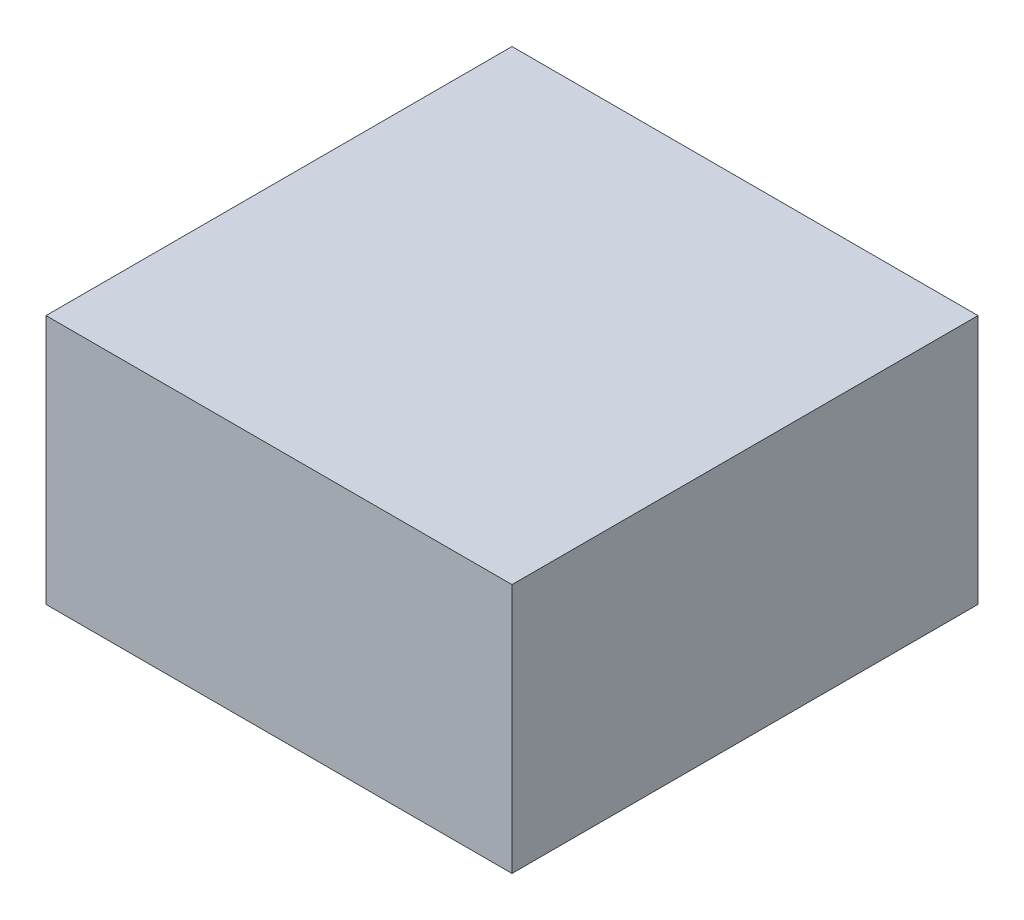
ISO-10303-21;
HEADER;
FILE_DESCRIPTION(('STEP AP214'),'2;1');
FILE_NAME('part.step','',(''),(''),'','','');
FILE_SCHEMA(('AUTOMOTIVE_DESIGN { 1 0 10303 214 1 1 1 1 }'));
ENDSEC;
DATA;
#1=APPLICATION_CONTEXT('core data for automotive mechanical design processes');
#2=APPLICATION_PROTOCOL_DEFINITION('international standard','automotive_design',2000,#1);
#3=PRODUCT_CONTEXT('',#1,'mechanical');
#4=PRODUCT('Part','Part','',(#3));
#5=PRODUCT_RELATED_PRODUCT_CATEGORY('part','',(#4));
#6=PRODUCT_DEFINITION_FORMATION('','',#4);
#7=PRODUCT_DEFINITION_CONTEXT('part definition',#1,'design');
#8=PRODUCT_DEFINITION('design','',#6,#7);
#9=PRODUCT_DEFINITION_SHAPE('','',#8);
#10=(LENGTH_UNIT() NAMED_UNIT(*) SI_UNIT(.MILLI.,.METRE.));
#11=(NAMED_UNIT(*) PLANE_ANGLE_UNIT() SI_UNIT($,.RADIAN.));
#12=(NAMED_UNIT(*) SI_UNIT($,.STERADIAN.) SOLID_ANGLE_UNIT());
#13=UNCERTAINTY_MEASURE_WITH_UNIT(LENGTH_MEASURE(1.E-05),#10,'distance_accuracy_value','');
#14=(GEOMETRIC_REPRESENTATION_CONTEXT(3) GLOBAL_UNCERTAINTY_ASSIGNED_CONTEXT((#13)) GLOBAL_UNIT_ASSIGNED_CONTEXT((#10,
#11,#12)) REPRESENTATION_CONTEXT('',''));
#15=CARTESIAN_POINT('',(0.,0.,0.));
#16=DIRECTION('',(0.,0.,1.));
#17=DIRECTION('',(1.,0.,0.));
#18=AXIS2_PLACEMENT_3D('',#15,#16,#17);
#19=CARTESIAN_POINT('',(6.3738019169329,36.1182108626198,95.));
#20=DIRECTION('',(1.,0.,0.));
#21=DIRECTION('',(0.,1.,0.));
#22=AXIS2_PLACEMENT_3D('',#19,#20,#21);
#23=PLANE('',#22);
#24=DIRECTION('',(0.,-1.,0.));
#25=VECTOR('',#24,1.);
#26=CARTESIAN_POINT('',(6.3738019169329,36.1182108626198,0.));
#27=LINE('',#26,#25);
#28=CARTESIAN_POINT('',(6.3738019169329,36.1182108626198,0.));
#29=VERTEX_POINT('',#28);
#30=CARTESIAN_POINT('',(6.37380191693291,-14.8817891373802,0.));
#31=VERTEX_POINT('',#30);
#32=EDGE_CURVE('E107',#29,#31,#27,.T.);
#33=ORIENTED_EDGE('',*,*,#32,.T.);
#34=DIRECTION('',(0.,0.,-1.));
#35=VECTOR('',#34,1.);
#36=CARTESIAN_POINT('',(6.37380191693291,-14.8817891373802,95.));
#37=LINE('',#36,#35);
#38=CARTESIAN_POINT('',(6.37380191693291,-14.8817891373802,95.));
#39=VERTEX_POINT('',#38);
#40=EDGE_CURVE('E11',#39,#31,#37,.T.);
#41=ORIENTED_EDGE('',*,*,#40,.F.);
#42=DIRECTION('',(0.,-1.,0.));
#43=VECTOR('',#42,1.);
#44=CARTESIAN_POINT('',(6.3738019169329,36.1182108626198,95.));
#45=LINE('',#44,#43);
#46=CARTESIAN_POINT('',(6.3738019169329,36.1182108626198,95.));
#47=VERTEX_POINT('',#46);
#48=EDGE_CURVE('E91',#47,#39,#45,.T.);
#49=ORIENTED_EDGE('',*,*,#48,.F.);
#50=DIRECTION('',(0.,0.,-1.));
#51=VECTOR('',#50,1.);
#52=CARTESIAN_POINT('',(6.3738019169329,36.1182108626198,95.));
#53=LINE('',#52,#51);
#54=EDGE_CURVE('E103',#47,#29,#53,.T.);
#55=ORIENTED_EDGE('',*,*,#54,.T.);
#56=EDGE_LOOP('',(#33,#41,#49,#55));
#57=FACE_BOUND('',#56,.T.);
#58=ADVANCED_FACE('F39',(#57),#23,.F.);
#59=CARTESIAN_POINT('',(6.37380191693291,-14.8817891373802,95.));
#60=DIRECTION('',(0.,1.,0.));
#61=DIRECTION('',(0.,0.,1.));
#62=AXIS2_PLACEMENT_3D('',#59,#60,#61);
#63=PLANE('',#62);
#64=DIRECTION('',(1.,0.,0.));
#65=VECTOR('',#64,1.);
#66=CARTESIAN_POINT('',(6.37380191693291,-14.8817891373802,0.));
#67=LINE('',#66,#65);
#68=CARTESIAN_POINT('',(101.373801916933,-14.8817891373802,0.));
#69=VERTEX_POINT('',#68);
#70=EDGE_CURVE('E96',#31,#69,#67,.T.);
#71=ORIENTED_EDGE('',*,*,#70,.T.);
#72=DIRECTION('',(0.,0.,-1.));
#73=VECTOR('',#72,1.);
#74=CARTESIAN_POINT('',(101.373801916933,-14.8817891373802,95.));
#75=LINE('',#74,#73);
#76=CARTESIAN_POINT('',(101.373801916933,-14.8817891373802,95.));
#77=VERTEX_POINT('',#76);
#78=EDGE_CURVE('E48',#77,#69,#75,.T.);
#79=ORIENTED_EDGE('',*,*,#78,.F.);
#80=DIRECTION('',(1.,0.,0.));
#81=VECTOR('',#80,1.);
#82=CARTESIAN_POINT('',(6.37380191693291,-14.8817891373802,95.));
#83=LINE('',#82,#81);
#84=EDGE_CURVE('E86',#39,#77,#83,.T.);
#85=ORIENTED_EDGE('',*,*,#84,.F.);
#86=ORIENTED_EDGE('',*,*,#40,.T.);
#87=EDGE_LOOP('',(#71,#79,#85,#86));
#88=FACE_BOUND('',#87,.T.);
#89=ADVANCED_FACE('F95',(#88),#63,.F.);
#90=CARTESIAN_POINT('',(101.373801916933,36.1182108626198,95.));
#91=DIRECTION('',(-1.,0.,0.));
#92=DIRECTION('',(0.,-1.,0.));
#93=AXIS2_PLACEMENT_3D('',#90,#91,#92);
#94=PLANE('',#93);
#95=DIRECTION('',(0.,1.,0.));
#96=VECTOR('',#95,1.);
#97=CARTESIAN_POINT('',(101.373801916933,36.1182108626198,0.));
#98=LINE('',#97,#96);
#99=CARTESIAN_POINT('',(101.373801916933,36.1182108626198,0.));
#100=VERTEX_POINT('',#99);
#101=EDGE_CURVE('E73',#69,#100,#98,.T.);
#102=ORIENTED_EDGE('',*,*,#101,.T.);
#103=DIRECTION('',(0.,0.,-1.));
#104=VECTOR('',#103,1.);
#105=CARTESIAN_POINT('',(101.373801916933,36.1182108626198,95.));
#106=LINE('',#105,#104);
#107=CARTESIAN_POINT('',(101.373801916933,36.1182108626198,95.));
#108=VERTEX_POINT('',#107);
#109=EDGE_CURVE('E98',#108,#100,#106,.T.);
#110=ORIENTED_EDGE('',*,*,#109,.F.);
#111=DIRECTION('',(0.,1.,0.));
#112=VECTOR('',#111,1.);
#113=CARTESIAN_POINT('',(101.373801916933,36.1182108626198,95.));
#114=LINE('',#113,#112);
#115=EDGE_CURVE('E89',#77,#108,#114,.T.);
#116=ORIENTED_EDGE('',*,*,#115,.F.);
#117=ORIENTED_EDGE('',*,*,#78,.T.);
#118=EDGE_LOOP('',(#102,#110,#116,#117));
#119=FACE_BOUND('',#118,.T.);
#120=ADVANCED_FACE('F99',(#119),#94,.F.);
#121=CARTESIAN_POINT('',(6.3738019169329,36.1182108626198,95.));
#122=DIRECTION('',(0.,-1.,0.));
#123=DIRECTION('',(0.,0.,-1.));
#124=AXIS2_PLACEMENT_3D('',#121,#122,#123);
#125=PLANE('',#124);
#126=DIRECTION('',(-1.,0.,0.));
#127=VECTOR('',#126,1.);
#128=CARTESIAN_POINT('',(6.3738019169329,36.1182108626198,0.));
#129=LINE('',#128,#127);
#130=EDGE_CURVE('E79',#100,#29,#129,.T.);
#131=ORIENTED_EDGE('',*,*,#130,.T.);
#132=ORIENTED_EDGE('',*,*,#54,.F.);
#133=DIRECTION('',(-1.,0.,0.));
#134=VECTOR('',#133,1.);
#135=CARTESIAN_POINT('',(6.3738019169329,36.1182108626198,95.));
#136=LINE('',#135,#134);
#137=EDGE_CURVE('E56',#108,#47,#136,.T.);
#138=ORIENTED_EDGE('',*,*,#137,.F.);
#139=ORIENTED_EDGE('',*,*,#109,.T.);
#140=EDGE_LOOP('',(#131,#132,#138,#139));
#141=FACE_BOUND('',#140,.T.);
#142=ADVANCED_FACE('F120',(#141),#125,.F.);
#143=CARTESIAN_POINT('',(0.,0.,95.));
#144=DIRECTION('',(0.,0.,1.));
#145=DIRECTION('',(1.,0.,0.));
#146=AXIS2_PLACEMENT_3D('',#143,#144,#145);
#147=PLANE('',#146);
#148=ORIENTED_EDGE('',*,*,#48,.T.);
#149=ORIENTED_EDGE('',*,*,#84,.T.);
#150=ORIENTED_EDGE('',*,*,#115,.T.);
#151=ORIENTED_EDGE('',*,*,#137,.T.);
#152=EDGE_LOOP('',(#148,#149,#150,#151));
#153=FACE_BOUND('',#152,.T.);
#154=ADVANCED_FACE('F87',(#153),#147,.T.);
#155=CARTESIAN_POINT('',(0.,0.,0.));
#156=DIRECTION('',(0.,0.,1.));
#157=DIRECTION('',(1.,0.,0.));
#158=AXIS2_PLACEMENT_3D('',#155,#156,#157);
#159=PLANE('',#158);
#160=ORIENTED_EDGE('',*,*,#32,.F.);
#161=ORIENTED_EDGE('',*,*,#130,.F.);
#162=ORIENTED_EDGE('',*,*,#101,.F.);
#163=ORIENTED_EDGE('',*,*,#70,.F.);
#164=EDGE_LOOP('',(#160,#161,#162,#163));
#165=FACE_BOUND('',#164,.T.);
#166=ADVANCED_FACE('F123',(#165),#159,.F.);
#167=CLOSED_SHELL('',(#58,#89,#120,#142,#154,#166));
#168=MANIFOLD_SOLID_BREP('B2',#167);
#169=ADVANCED_BREP_SHAPE_REPRESENTATION('',(#18,#168),#14);
#170=SHAPE_DEFINITION_REPRESENTATION(#9,#169);
ENDSEC;
END-ISO-10303-21;
